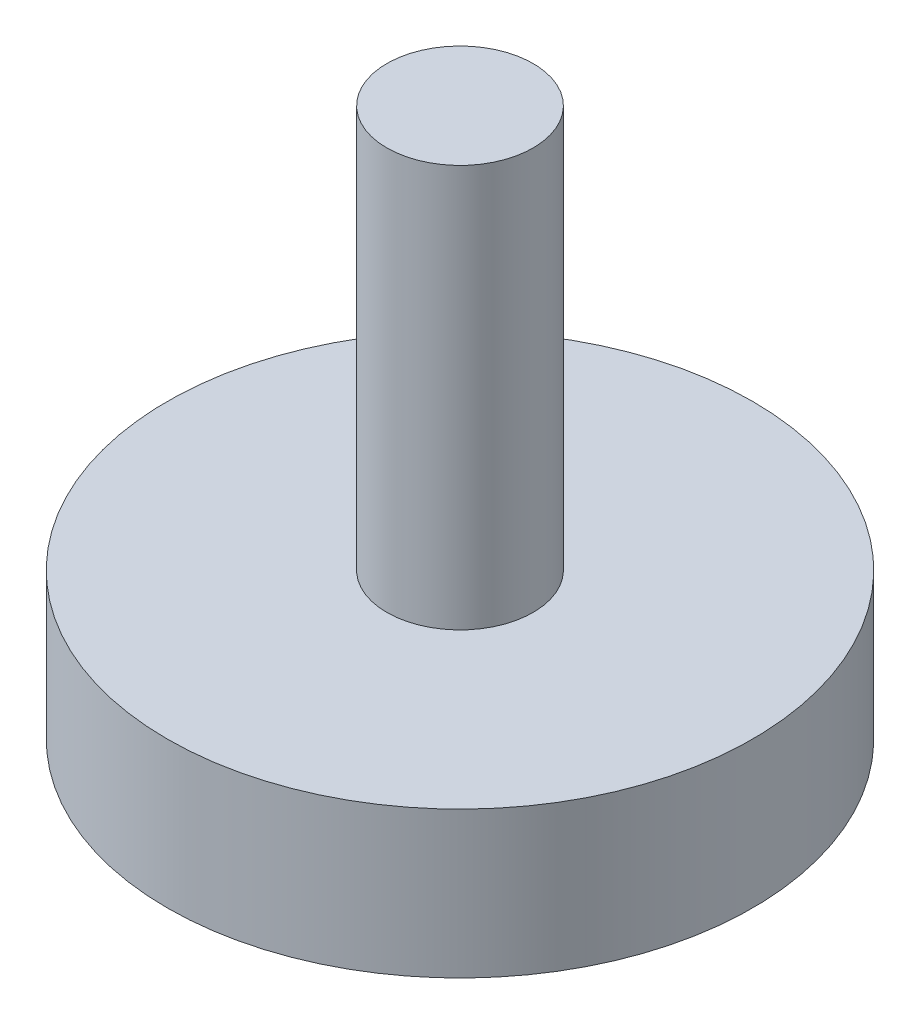
ISO-10303-21;
HEADER;
FILE_DESCRIPTION(('STEP AP214'),'2;1');
FILE_NAME('part.step','',(''),(''),'','','');
FILE_SCHEMA(('AUTOMOTIVE_DESIGN { 1 0 10303 214 1 1 1 1 }'));
ENDSEC;
DATA;
#1=APPLICATION_CONTEXT('core data for automotive mechanical design processes');
#2=APPLICATION_PROTOCOL_DEFINITION('international standard','automotive_design',2000,#1);
#3=PRODUCT_CONTEXT('',#1,'mechanical');
#4=PRODUCT('Part','Part','',(#3));
#5=PRODUCT_RELATED_PRODUCT_CATEGORY('part','',(#4));
#6=PRODUCT_DEFINITION_FORMATION('','',#4);
#7=PRODUCT_DEFINITION_CONTEXT('part definition',#1,'design');
#8=PRODUCT_DEFINITION('design','',#6,#7);
#9=PRODUCT_DEFINITION_SHAPE('','',#8);
#10=(LENGTH_UNIT() NAMED_UNIT(*) SI_UNIT(.MILLI.,.METRE.));
#11=(NAMED_UNIT(*) PLANE_ANGLE_UNIT() SI_UNIT($,.RADIAN.));
#12=(NAMED_UNIT(*) SI_UNIT($,.STERADIAN.) SOLID_ANGLE_UNIT());
#13=UNCERTAINTY_MEASURE_WITH_UNIT(LENGTH_MEASURE(1.E-05),#10,'distance_accuracy_value','');
#14=(GEOMETRIC_REPRESENTATION_CONTEXT(3) GLOBAL_UNCERTAINTY_ASSIGNED_CONTEXT((#13)) GLOBAL_UNIT_ASSIGNED_CONTEXT((#10,
#11,#12)) REPRESENTATION_CONTEXT('',''));
#15=CARTESIAN_POINT('',(0.,0.,0.));
#16=DIRECTION('',(0.,0.,1.));
#17=DIRECTION('',(1.,0.,0.));
#18=AXIS2_PLACEMENT_3D('',#15,#16,#17);
#19=CARTESIAN_POINT('',(0.,20.,0.));
#20=DIRECTION('',(0.,-1.,0.));
#21=DIRECTION('',(0.,0.,-1.));
#22=AXIS2_PLACEMENT_3D('',#19,#20,#21);
#23=CYLINDRICAL_SURFACE('',#22,40.);
#24=CARTESIAN_POINT('',(0.,20.,0.));
#25=DIRECTION('',(0.,1.,0.));
#26=DIRECTION('',(0.,0.,1.));
#27=AXIS2_PLACEMENT_3D('',#24,#25,#26);
#28=CIRCLE('',#27,40.);
#29=CARTESIAN_POINT('',(0.,20.,40.));
#30=VERTEX_POINT('',#29);
#31=EDGE_CURVE('E40',#30,#30,#28,.T.);
#32=ORIENTED_EDGE('',*,*,#31,.F.);
#33=EDGE_LOOP('',(#32));
#34=FACE_BOUND('',#33,.T.);
#35=CARTESIAN_POINT('',(0.,0.,0.));
#36=DIRECTION('',(0.,1.,0.));
#37=DIRECTION('',(0.,0.,1.));
#38=AXIS2_PLACEMENT_3D('',#35,#36,#37);
#39=CIRCLE('',#38,40.);
#40=CARTESIAN_POINT('',(0.,0.,40.));
#41=VERTEX_POINT('',#40);
#42=EDGE_CURVE('E36',#41,#41,#39,.T.);
#43=ORIENTED_EDGE('',*,*,#42,.T.);
#44=EDGE_LOOP('',(#43));
#45=FACE_BOUND('',#44,.T.);
#46=ADVANCED_FACE('F33',(#34,#45),#23,.T.);
#47=CARTESIAN_POINT('',(0.,20.,0.));
#48=DIRECTION('',(0.,1.,0.));
#49=DIRECTION('',(0.,0.,1.));
#50=AXIS2_PLACEMENT_3D('',#47,#48,#49);
#51=PLANE('',#50);
#52=CARTESIAN_POINT('',(0.,20.,0.));
#53=DIRECTION('',(0.,1.,0.));
#54=DIRECTION('',(0.,0.,1.));
#55=AXIS2_PLACEMENT_3D('',#52,#53,#54);
#56=CIRCLE('',#55,10.);
#57=CARTESIAN_POINT('',(0.,20.,10.));
#58=VERTEX_POINT('',#57);
#59=EDGE_CURVE('E10',#58,#58,#56,.T.);
#60=ORIENTED_EDGE('',*,*,#59,.F.);
#61=EDGE_LOOP('',(#60));
#62=FACE_BOUND('',#61,.T.);
#63=ORIENTED_EDGE('',*,*,#31,.T.);
#64=EDGE_LOOP('',(#63));
#65=FACE_BOUND('',#64,.T.);
#66=ADVANCED_FACE('F57',(#62,#65),#51,.T.);
#67=CARTESIAN_POINT('',(0.,0.,0.));
#68=DIRECTION('',(0.,1.,0.));
#69=DIRECTION('',(0.,0.,1.));
#70=AXIS2_PLACEMENT_3D('',#67,#68,#69);
#71=PLANE('',#70);
#72=ORIENTED_EDGE('',*,*,#42,.F.);
#73=EDGE_LOOP('',(#72));
#74=FACE_BOUND('',#73,.T.);
#75=ADVANCED_FACE('F54',(#74),#71,.F.);
#76=CARTESIAN_POINT('',(0.,75.,0.));
#77=DIRECTION('',(0.,-1.,0.));
#78=DIRECTION('',(0.,0.,-1.));
#79=AXIS2_PLACEMENT_3D('',#76,#77,#78);
#80=CYLINDRICAL_SURFACE('',#79,10.);
#81=CARTESIAN_POINT('',(0.,75.,0.));
#82=DIRECTION('',(0.,1.,0.));
#83=DIRECTION('',(0.,0.,1.));
#84=AXIS2_PLACEMENT_3D('',#81,#82,#83);
#85=CIRCLE('',#84,10.);
#86=CARTESIAN_POINT('',(0.,75.,10.));
#87=VERTEX_POINT('',#86);
#88=EDGE_CURVE('E46',#87,#87,#85,.T.);
#89=ORIENTED_EDGE('',*,*,#88,.F.);
#90=EDGE_LOOP('',(#89));
#91=FACE_BOUND('',#90,.T.);
#92=ORIENTED_EDGE('',*,*,#59,.T.);
#93=EDGE_LOOP('',(#92));
#94=FACE_BOUND('',#93,.T.);
#95=ADVANCED_FACE('F56',(#91,#94),#80,.T.);
#96=CARTESIAN_POINT('',(0.,75.,0.));
#97=DIRECTION('',(0.,1.,0.));
#98=DIRECTION('',(0.,0.,1.));
#99=AXIS2_PLACEMENT_3D('',#96,#97,#98);
#100=PLANE('',#99);
#101=ORIENTED_EDGE('',*,*,#88,.T.);
#102=EDGE_LOOP('',(#101));
#103=FACE_BOUND('',#102,.T.);
#104=ADVANCED_FACE('F62',(#103),#100,.T.);
#105=CLOSED_SHELL('',(#46,#66,#75,#95,#104));
#106=MANIFOLD_SOLID_BREP('B2',#105);
#107=ADVANCED_BREP_SHAPE_REPRESENTATION('',(#18,#106),#14);
#108=SHAPE_DEFINITION_REPRESENTATION(#9,#107);
ENDSEC;
END-ISO-10303-21;
